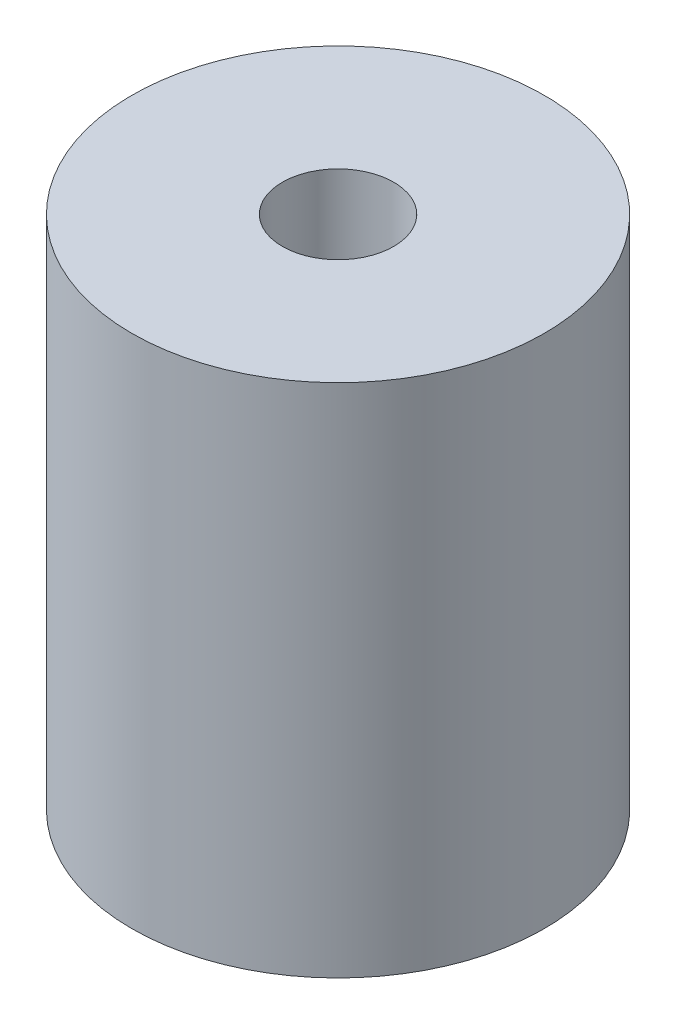
ISO-10303-21;
HEADER;
FILE_DESCRIPTION(('STEP AP214'),'2;1');
FILE_NAME('part.step','',(''),(''),'','','');
FILE_SCHEMA(('AUTOMOTIVE_DESIGN { 1 0 10303 214 1 1 1 1 }'));
ENDSEC;
DATA;
#1=APPLICATION_CONTEXT('core data for automotive mechanical design processes');
#2=APPLICATION_PROTOCOL_DEFINITION('international standard','automotive_design',2000,#1);
#3=PRODUCT_CONTEXT('',#1,'mechanical');
#4=PRODUCT('Part','Part','',(#3));
#5=PRODUCT_RELATED_PRODUCT_CATEGORY('part','',(#4));
#6=PRODUCT_DEFINITION_FORMATION('','',#4);
#7=PRODUCT_DEFINITION_CONTEXT('part definition',#1,'design');
#8=PRODUCT_DEFINITION('design','',#6,#7);
#9=PRODUCT_DEFINITION_SHAPE('','',#8);
#10=(LENGTH_UNIT() NAMED_UNIT(*) SI_UNIT(.MILLI.,.METRE.));
#11=(NAMED_UNIT(*) PLANE_ANGLE_UNIT() SI_UNIT($,.RADIAN.));
#12=(NAMED_UNIT(*) SI_UNIT($,.STERADIAN.) SOLID_ANGLE_UNIT());
#13=UNCERTAINTY_MEASURE_WITH_UNIT(LENGTH_MEASURE(1.E-05),#10,'distance_accuracy_value','');
#14=(GEOMETRIC_REPRESENTATION_CONTEXT(3) GLOBAL_UNCERTAINTY_ASSIGNED_CONTEXT((#13)) GLOBAL_UNIT_ASSIGNED_CONTEXT((#10,
#11,#12)) REPRESENTATION_CONTEXT('',''));
#15=CARTESIAN_POINT('',(0.,0.,0.));
#16=DIRECTION('',(0.,0.,1.));
#17=DIRECTION('',(1.,0.,0.));
#18=AXIS2_PLACEMENT_3D('',#15,#16,#17);
#19=CARTESIAN_POINT('',(0.,12.5,0.));
#20=DIRECTION('',(0.,-1.,0.));
#21=DIRECTION('',(0.,0.,-1.));
#22=AXIS2_PLACEMENT_3D('',#19,#20,#21);
#23=CYLINDRICAL_SURFACE('',#22,10.);
#24=CARTESIAN_POINT('',(0.,12.5,0.));
#25=DIRECTION('',(0.,1.,0.));
#26=DIRECTION('',(0.,0.,1.));
#27=AXIS2_PLACEMENT_3D('',#24,#25,#26);
#28=CIRCLE('',#27,10.);
#29=CARTESIAN_POINT('',(0.,12.5,10.));
#30=VERTEX_POINT('',#29);
#31=EDGE_CURVE('E10',#30,#30,#28,.T.);
#32=ORIENTED_EDGE('',*,*,#31,.F.);
#33=EDGE_LOOP('',(#32));
#34=FACE_BOUND('',#33,.T.);
#35=CARTESIAN_POINT('',(0.,-12.5,0.));
#36=DIRECTION('',(0.,1.,0.));
#37=DIRECTION('',(0.,0.,1.));
#38=AXIS2_PLACEMENT_3D('',#35,#36,#37);
#39=CIRCLE('',#38,10.);
#40=CARTESIAN_POINT('',(0.,-12.5,10.));
#41=VERTEX_POINT('',#40);
#42=EDGE_CURVE('E40',#41,#41,#39,.T.);
#43=ORIENTED_EDGE('',*,*,#42,.T.);
#44=EDGE_LOOP('',(#43));
#45=FACE_BOUND('',#44,.T.);
#46=ADVANCED_FACE('F37',(#34,#45),#23,.T.);
#47=CARTESIAN_POINT('',(0.,12.5,0.));
#48=DIRECTION('',(0.,1.,0.));
#49=DIRECTION('',(0.,0.,1.));
#50=AXIS2_PLACEMENT_3D('',#47,#48,#49);
#51=PLANE('',#50);
#52=CARTESIAN_POINT('',(0.,12.5,0.));
#53=DIRECTION('',(0.,1.,0.));
#54=DIRECTION('',(0.,0.,1.));
#55=AXIS2_PLACEMENT_3D('',#52,#53,#54);
#56=CIRCLE('',#55,2.69999999999992);
#57=CARTESIAN_POINT('',(0.,12.5,2.69999999999992));
#58=VERTEX_POINT('',#57);
#59=EDGE_CURVE('E49',#58,#58,#56,.T.);
#60=ORIENTED_EDGE('',*,*,#59,.F.);
#61=EDGE_LOOP('',(#60));
#62=FACE_BOUND('',#61,.T.);
#63=ORIENTED_EDGE('',*,*,#31,.T.);
#64=EDGE_LOOP('',(#63));
#65=FACE_BOUND('',#64,.T.);
#66=ADVANCED_FACE('F80',(#62,#65),#51,.T.);
#67=CARTESIAN_POINT('',(0.,-12.5,0.));
#68=DIRECTION('',(0.,1.,0.));
#69=DIRECTION('',(0.,0.,1.));
#70=AXIS2_PLACEMENT_3D('',#67,#68,#69);
#71=PLANE('',#70);
#72=CARTESIAN_POINT('',(0.,-12.5,0.));
#73=DIRECTION('',(0.,1.,0.));
#74=DIRECTION('',(0.,0.,1.));
#75=AXIS2_PLACEMENT_3D('',#72,#73,#74);
#76=CIRCLE('',#75,4.2);
#77=CARTESIAN_POINT('',(0.,-12.5,4.2));
#78=VERTEX_POINT('',#77);
#79=EDGE_CURVE('E58',#78,#78,#76,.F.);
#80=ORIENTED_EDGE('',*,*,#79,.F.);
#81=EDGE_LOOP('',(#80));
#82=FACE_BOUND('',#81,.T.);
#83=ORIENTED_EDGE('',*,*,#42,.F.);
#84=EDGE_LOOP('',(#83));
#85=FACE_BOUND('',#84,.T.);
#86=ADVANCED_FACE('F85',(#82,#85),#71,.F.);
#87=CARTESIAN_POINT('',(0.,20.1367532368145,0.));
#88=DIRECTION('',(0.,-1.,0.));
#89=DIRECTION('',(0.,0.,-1.));
#90=AXIS2_PLACEMENT_3D('',#87,#88,#89);
#91=CYLINDRICAL_SURFACE('',#90,2.69999999999992);
#92=CARTESIAN_POINT('',(0.,0.,0.));
#93=DIRECTION('',(0.,1.,0.));
#94=DIRECTION('',(0.,0.,1.));
#95=AXIS2_PLACEMENT_3D('',#92,#93,#94);
#96=CIRCLE('',#95,2.69999999999992);
#97=CARTESIAN_POINT('',(0.,0.,2.69999999999992));
#98=VERTEX_POINT('',#97);
#99=EDGE_CURVE('E54',#98,#98,#96,.T.);
#100=ORIENTED_EDGE('',*,*,#99,.F.);
#101=EDGE_LOOP('',(#100));
#102=FACE_BOUND('',#101,.T.);
#103=ORIENTED_EDGE('',*,*,#59,.T.);
#104=EDGE_LOOP('',(#103));
#105=FACE_BOUND('',#104,.T.);
#106=ADVANCED_FACE('F76',(#102,#105),#91,.F.);
#107=CARTESIAN_POINT('',(0.,-24.379393923934,0.));
#108=DIRECTION('',(0.,1.,0.));
#109=DIRECTION('',(0.,0.,1.));
#110=AXIS2_PLACEMENT_3D('',#107,#108,#109);
#111=CYLINDRICAL_SURFACE('',#110,4.2);
#112=ORIENTED_EDGE('',*,*,#79,.T.);
#113=EDGE_LOOP('',(#112));
#114=FACE_BOUND('',#113,.T.);
#115=CARTESIAN_POINT('',(0.,0.,0.));
#116=DIRECTION('',(0.,1.,0.));
#117=DIRECTION('',(0.,0.,1.));
#118=AXIS2_PLACEMENT_3D('',#115,#116,#117);
#119=CIRCLE('',#118,4.2);
#120=CARTESIAN_POINT('',(0.,0.,4.2));
#121=VERTEX_POINT('',#120);
#122=EDGE_CURVE('E62',#121,#121,#119,.T.);
#123=ORIENTED_EDGE('',*,*,#122,.T.);
#124=EDGE_LOOP('',(#123));
#125=FACE_BOUND('',#124,.T.);
#126=ADVANCED_FACE('F67',(#114,#125),#111,.F.);
#127=CARTESIAN_POINT('',(0.,0.,0.));
#128=DIRECTION('',(0.,1.,0.));
#129=DIRECTION('',(0.,0.,1.));
#130=AXIS2_PLACEMENT_3D('',#127,#128,#129);
#131=PLANE('',#130);
#132=ORIENTED_EDGE('',*,*,#99,.T.);
#133=EDGE_LOOP('',(#132));
#134=FACE_BOUND('',#133,.T.);
#135=ORIENTED_EDGE('',*,*,#122,.F.);
#136=EDGE_LOOP('',(#135));
#137=FACE_BOUND('',#136,.T.);
#138=ADVANCED_FACE('F69',(#134,#137),#131,.F.);
#139=CLOSED_SHELL('',(#46,#66,#86,#106,#126,#138));
#140=MANIFOLD_SOLID_BREP('B2',#139);
#141=ADVANCED_BREP_SHAPE_REPRESENTATION('',(#18,#140),#14);
#142=SHAPE_DEFINITION_REPRESENTATION(#9,#141);
ENDSEC;
END-ISO-10303-21;
